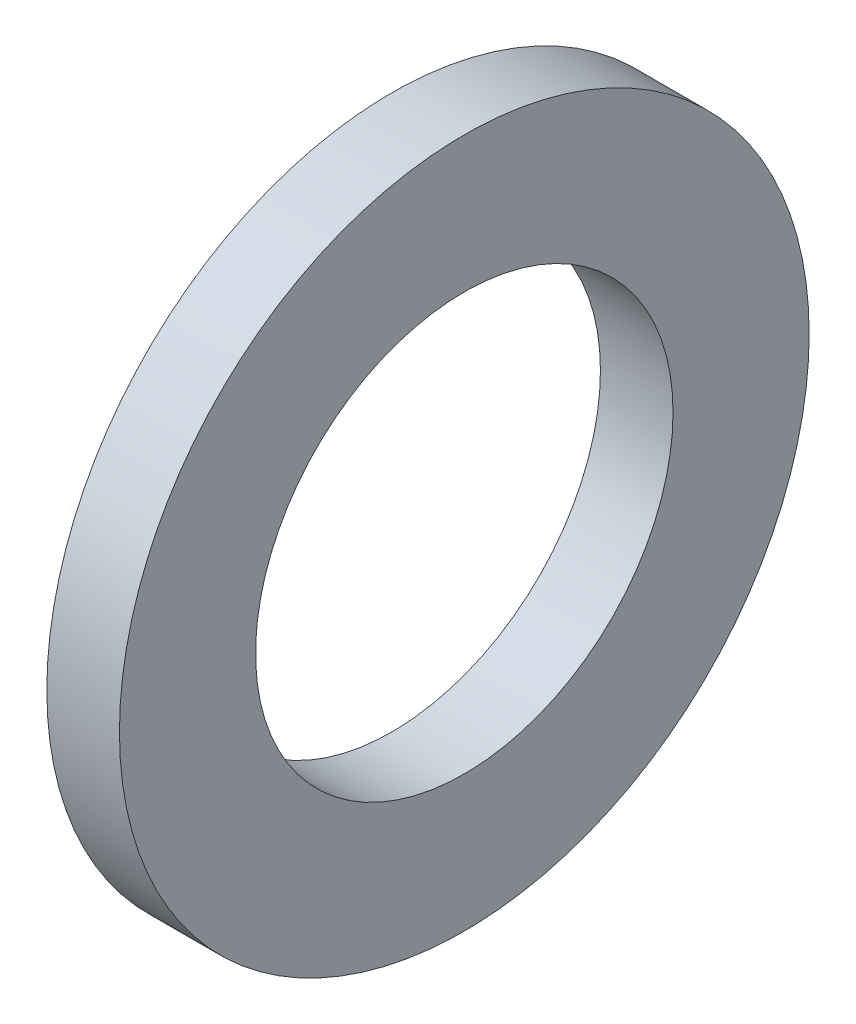
ISO-10303-21;
HEADER;
FILE_DESCRIPTION(('STEP AP214'),'2;1');
FILE_NAME('part.step','',(''),(''),'','','');
FILE_SCHEMA(('AUTOMOTIVE_DESIGN { 1 0 10303 214 1 1 1 1 }'));
ENDSEC;
DATA;
#1=APPLICATION_CONTEXT('core data for automotive mechanical design processes');
#2=APPLICATION_PROTOCOL_DEFINITION('international standard','automotive_design',2000,#1);
#3=PRODUCT_CONTEXT('',#1,'mechanical');
#4=PRODUCT('Part','Part','',(#3));
#5=PRODUCT_RELATED_PRODUCT_CATEGORY('part','',(#4));
#6=PRODUCT_DEFINITION_FORMATION('','',#4);
#7=PRODUCT_DEFINITION_CONTEXT('part definition',#1,'design');
#8=PRODUCT_DEFINITION('design','',#6,#7);
#9=PRODUCT_DEFINITION_SHAPE('','',#8);
#10=(LENGTH_UNIT() NAMED_UNIT(*) SI_UNIT(.MILLI.,.METRE.));
#11=(NAMED_UNIT(*) PLANE_ANGLE_UNIT() SI_UNIT($,.RADIAN.));
#12=(NAMED_UNIT(*) SI_UNIT($,.STERADIAN.) SOLID_ANGLE_UNIT());
#13=UNCERTAINTY_MEASURE_WITH_UNIT(LENGTH_MEASURE(1.E-05),#10,'distance_accuracy_value','');
#14=(GEOMETRIC_REPRESENTATION_CONTEXT(3) GLOBAL_UNCERTAINTY_ASSIGNED_CONTEXT((#13)) GLOBAL_UNIT_ASSIGNED_CONTEXT((#10,
#11,#12)) REPRESENTATION_CONTEXT('',''));
#15=CARTESIAN_POINT('',(0.,0.,0.));
#16=DIRECTION('',(0.,0.,1.));
#17=DIRECTION('',(1.,0.,0.));
#18=AXIS2_PLACEMENT_3D('',#15,#16,#17);
#19=CARTESIAN_POINT('',(0.,0.,0.));
#20=DIRECTION('',(1.,0.,0.));
#21=DIRECTION('',(0.,0.,-1.));
#22=AXIS2_PLACEMENT_3D('',#19,#20,#21);
#23=CYLINDRICAL_SURFACE('',#22,60.325);
#24=CARTESIAN_POINT('',(21.844,0.,0.));
#25=DIRECTION('',(1.,0.,0.));
#26=DIRECTION('',(0.,0.,-1.));
#27=AXIS2_PLACEMENT_3D('',#24,#25,#26);
#28=CIRCLE('',#27,60.325);
#29=CARTESIAN_POINT('',(21.844,0.,-60.325));
#30=VERTEX_POINT('',#29);
#31=EDGE_CURVE('E53',#30,#30,#28,.T.);
#32=ORIENTED_EDGE('',*,*,#31,.T.);
#33=EDGE_LOOP('',(#32));
#34=FACE_BOUND('',#33,.T.);
#35=CARTESIAN_POINT('',(34.544,0.,0.));
#36=DIRECTION('',(1.,0.,0.));
#37=DIRECTION('',(0.,0.,-1.));
#38=AXIS2_PLACEMENT_3D('',#35,#36,#37);
#39=CIRCLE('',#38,60.325);
#40=CARTESIAN_POINT('',(34.544,0.,-60.325));
#41=VERTEX_POINT('',#40);
#42=EDGE_CURVE('E10',#41,#41,#39,.T.);
#43=ORIENTED_EDGE('',*,*,#42,.F.);
#44=EDGE_LOOP('',(#43));
#45=FACE_BOUND('',#44,.T.);
#46=ADVANCED_FACE('F39',(#34,#45),#23,.T.);
#47=CARTESIAN_POINT('',(34.544,0.,0.));
#48=DIRECTION('',(1.,0.,0.));
#49=DIRECTION('',(0.,0.,-1.));
#50=AXIS2_PLACEMENT_3D('',#47,#48,#49);
#51=PLANE('',#50);
#52=ORIENTED_EDGE('',*,*,#42,.T.);
#53=EDGE_LOOP('',(#52));
#54=FACE_BOUND('',#53,.T.);
#55=CARTESIAN_POINT('',(34.544,0.,0.));
#56=DIRECTION('',(1.,0.,0.));
#57=DIRECTION('',(0.,0.,-1.));
#58=AXIS2_PLACEMENT_3D('',#55,#56,#57);
#59=CIRCLE('',#58,36.5125);
#60=CARTESIAN_POINT('',(34.544,0.,-36.5125));
#61=VERTEX_POINT('',#60);
#62=EDGE_CURVE('E45',#61,#61,#59,.T.);
#63=ORIENTED_EDGE('',*,*,#62,.F.);
#64=EDGE_LOOP('',(#63));
#65=FACE_BOUND('',#64,.T.);
#66=ADVANCED_FACE('F70',(#54,#65),#51,.T.);
#67=CARTESIAN_POINT('',(0.,0.,0.));
#68=DIRECTION('',(1.,0.,0.));
#69=DIRECTION('',(0.,0.,-1.));
#70=AXIS2_PLACEMENT_3D('',#67,#68,#69);
#71=CYLINDRICAL_SURFACE('',#70,36.5125);
#72=ORIENTED_EDGE('',*,*,#62,.T.);
#73=EDGE_LOOP('',(#72));
#74=FACE_BOUND('',#73,.T.);
#75=CARTESIAN_POINT('',(21.844,0.,0.));
#76=DIRECTION('',(1.,0.,0.));
#77=DIRECTION('',(0.,0.,-1.));
#78=AXIS2_PLACEMENT_3D('',#75,#76,#77);
#79=CIRCLE('',#78,36.5125);
#80=CARTESIAN_POINT('',(21.844,0.,-36.5125));
#81=VERTEX_POINT('',#80);
#82=EDGE_CURVE('E49',#81,#81,#79,.T.);
#83=ORIENTED_EDGE('',*,*,#82,.F.);
#84=EDGE_LOOP('',(#83));
#85=FACE_BOUND('',#84,.T.);
#86=ADVANCED_FACE('F63',(#74,#85),#71,.F.);
#87=CARTESIAN_POINT('',(21.844,0.,0.));
#88=DIRECTION('',(-1.,0.,0.));
#89=DIRECTION('',(0.,0.,1.));
#90=AXIS2_PLACEMENT_3D('',#87,#88,#89);
#91=PLANE('',#90);
#92=ORIENTED_EDGE('',*,*,#82,.T.);
#93=EDGE_LOOP('',(#92));
#94=FACE_BOUND('',#93,.T.);
#95=ORIENTED_EDGE('',*,*,#31,.F.);
#96=EDGE_LOOP('',(#95));
#97=FACE_BOUND('',#96,.T.);
#98=ADVANCED_FACE('F61',(#94,#97),#91,.T.);
#99=CLOSED_SHELL('',(#46,#66,#86,#98));
#100=MANIFOLD_SOLID_BREP('B2',#99);
#101=ADVANCED_BREP_SHAPE_REPRESENTATION('',(#18,#100),#14);
#102=SHAPE_DEFINITION_REPRESENTATION(#9,#101);
ENDSEC;
END-ISO-10303-21;
